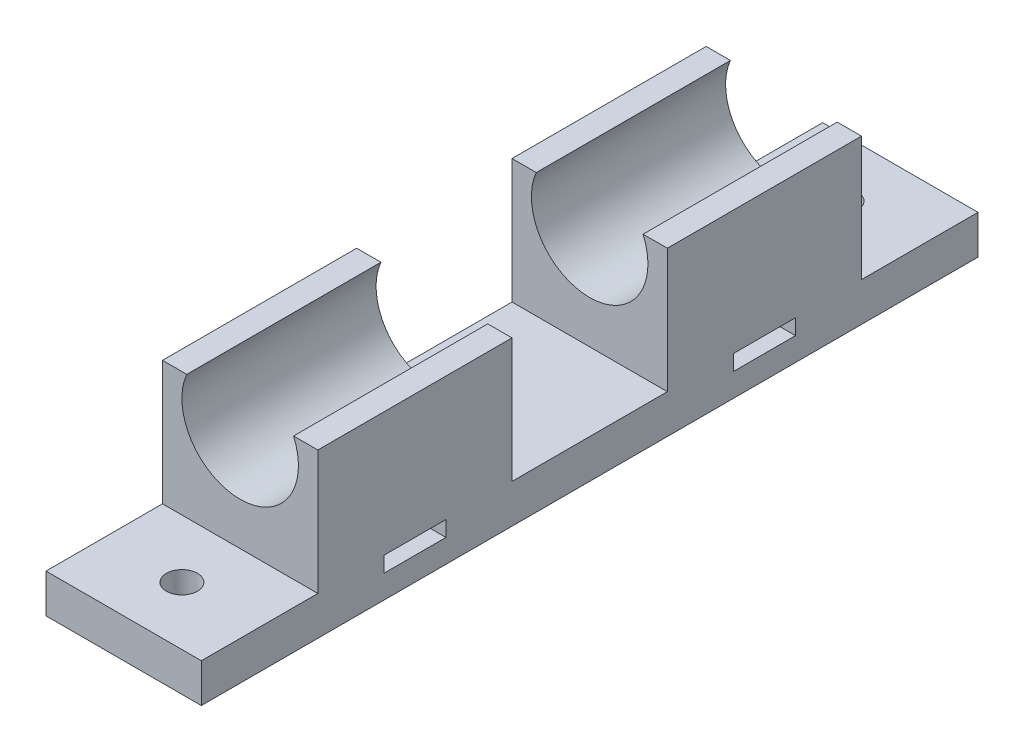
ISO-10303-21;
HEADER;
FILE_DESCRIPTION(('STEP AP214'),'2;1');
FILE_NAME('part.step','',(''),(''),'','','');
FILE_SCHEMA(('AUTOMOTIVE_DESIGN { 1 0 10303 214 1 1 1 1 }'));
ENDSEC;
DATA;
#1=APPLICATION_CONTEXT('core data for automotive mechanical design processes');
#2=APPLICATION_PROTOCOL_DEFINITION('international standard','automotive_design',2000,#1);
#3=PRODUCT_CONTEXT('',#1,'mechanical');
#4=PRODUCT('Part','Part','',(#3));
#5=PRODUCT_RELATED_PRODUCT_CATEGORY('part','',(#4));
#6=PRODUCT_DEFINITION_FORMATION('','',#4);
#7=PRODUCT_DEFINITION_CONTEXT('part definition',#1,'design');
#8=PRODUCT_DEFINITION('design','',#6,#7);
#9=PRODUCT_DEFINITION_SHAPE('','',#8);
#10=(LENGTH_UNIT() NAMED_UNIT(*) SI_UNIT(.MILLI.,.METRE.));
#11=(NAMED_UNIT(*) PLANE_ANGLE_UNIT() SI_UNIT($,.RADIAN.));
#12=(NAMED_UNIT(*) SI_UNIT($,.STERADIAN.) SOLID_ANGLE_UNIT());
#13=UNCERTAINTY_MEASURE_WITH_UNIT(LENGTH_MEASURE(1.E-05),#10,'distance_accuracy_value','');
#14=(GEOMETRIC_REPRESENTATION_CONTEXT(3) GLOBAL_UNCERTAINTY_ASSIGNED_CONTEXT((#13)) GLOBAL_UNIT_ASSIGNED_CONTEXT((#10,
#11,#12)) REPRESENTATION_CONTEXT('',''));
#15=CARTESIAN_POINT('',(0.,0.,0.));
#16=DIRECTION('',(0.,0.,1.));
#17=DIRECTION('',(1.,0.,0.));
#18=AXIS2_PLACEMENT_3D('',#15,#16,#17);
#19=CARTESIAN_POINT('',(10.,21.,35.));
#20=DIRECTION('',(0.,0.,-1.));
#21=DIRECTION('',(-1.,0.,0.));
#22=AXIS2_PLACEMENT_3D('',#19,#20,#21);
#23=PLANE('',#22);
#24=DIRECTION('',(-1.,0.,0.));
#25=VECTOR('',#24,1.);
#26=CARTESIAN_POINT('',(-10.,5.,35.));
#27=LINE('',#26,#25);
#28=CARTESIAN_POINT('',(10.,5.,35.));
#29=VERTEX_POINT('',#28);
#30=CARTESIAN_POINT('',(-10.,5.,35.));
#31=VERTEX_POINT('',#30);
#32=EDGE_CURVE('E47',#29,#31,#27,.T.);
#33=ORIENTED_EDGE('',*,*,#32,.F.);
#34=DIRECTION('',(0.,-1.,0.));
#35=VECTOR('',#34,1.);
#36=CARTESIAN_POINT('',(10.,21.,35.));
#37=LINE('',#36,#35);
#38=CARTESIAN_POINT('',(10.,21.,35.));
#39=VERTEX_POINT('',#38);
#40=EDGE_CURVE('E332',#39,#29,#37,.T.);
#41=ORIENTED_EDGE('',*,*,#40,.F.);
#42=DIRECTION('',(-1.,0.,0.));
#43=VECTOR('',#42,1.);
#44=CARTESIAN_POINT('',(10.,21.,35.));
#45=LINE('',#44,#43);
#46=CARTESIAN_POINT('',(6.87386354243376,21.,35.));
#47=VERTEX_POINT('',#46);
#48=EDGE_CURVE('E363',#39,#47,#45,.T.);
#49=ORIENTED_EDGE('',*,*,#48,.T.);
#50=CARTESIAN_POINT('',(0.,18.,35.));
#51=DIRECTION('',(0.,0.,1.));
#52=DIRECTION('',(1.,0.,0.));
#53=AXIS2_PLACEMENT_3D('',#50,#51,#52);
#54=CIRCLE('',#53,7.5);
#55=CARTESIAN_POINT('',(-6.87386354243376,21.,35.));
#56=VERTEX_POINT('',#55);
#57=EDGE_CURVE('E256',#56,#47,#54,.T.);
#58=ORIENTED_EDGE('',*,*,#57,.F.);
#59=CARTESIAN_POINT('',(-10.,21.,35.));
#60=VERTEX_POINT('',#59);
#61=EDGE_CURVE('E196',#56,#60,#45,.T.);
#62=ORIENTED_EDGE('',*,*,#61,.T.);
#63=DIRECTION('',(0.,-1.,0.));
#64=VECTOR('',#63,1.);
#65=CARTESIAN_POINT('',(-10.,21.,35.));
#66=LINE('',#65,#64);
#67=EDGE_CURVE('E192',#60,#31,#66,.T.);
#68=ORIENTED_EDGE('',*,*,#67,.T.);
#69=EDGE_LOOP('',(#33,#41,#49,#58,#62,#68));
#70=FACE_BOUND('',#69,.T.);
#71=ADVANCED_FACE('F33',(#70),#23,.F.);
#72=CARTESIAN_POINT('',(10.,21.,-35.));
#73=DIRECTION('',(0.,0.,1.));
#74=DIRECTION('',(1.,0.,0.));
#75=AXIS2_PLACEMENT_3D('',#72,#73,#74);
#76=PLANE('',#75);
#77=DIRECTION('',(1.,0.,0.));
#78=VECTOR('',#77,1.);
#79=CARTESIAN_POINT('',(-10.,5.,-35.));
#80=LINE('',#79,#78);
#81=CARTESIAN_POINT('',(-10.,5.,-35.));
#82=VERTEX_POINT('',#81);
#83=CARTESIAN_POINT('',(10.,5.,-35.));
#84=VERTEX_POINT('',#83);
#85=EDGE_CURVE('E55',#82,#84,#80,.T.);
#86=ORIENTED_EDGE('',*,*,#85,.F.);
#87=DIRECTION('',(0.,1.,0.));
#88=VECTOR('',#87,1.);
#89=CARTESIAN_POINT('',(-10.,21.,-35.));
#90=LINE('',#89,#88);
#91=CARTESIAN_POINT('',(-10.,21.,-35.));
#92=VERTEX_POINT('',#91);
#93=EDGE_CURVE('E350',#82,#92,#90,.T.);
#94=ORIENTED_EDGE('',*,*,#93,.T.);
#95=DIRECTION('',(-1.,0.,0.));
#96=VECTOR('',#95,1.);
#97=CARTESIAN_POINT('',(10.,21.,-35.));
#98=LINE('',#97,#96);
#99=CARTESIAN_POINT('',(-6.87386354243376,21.,-35.));
#100=VERTEX_POINT('',#99);
#101=EDGE_CURVE('E380',#100,#92,#98,.T.);
#102=ORIENTED_EDGE('',*,*,#101,.F.);
#103=CARTESIAN_POINT('',(0.,18.,-35.));
#104=DIRECTION('',(0.,0.,1.));
#105=DIRECTION('',(1.,0.,0.));
#106=AXIS2_PLACEMENT_3D('',#103,#104,#105);
#107=CIRCLE('',#106,7.5);
#108=CARTESIAN_POINT('',(6.87386354243376,21.,-35.));
#109=VERTEX_POINT('',#108);
#110=EDGE_CURVE('E257',#109,#100,#107,.F.);
#111=ORIENTED_EDGE('',*,*,#110,.F.);
#112=CARTESIAN_POINT('',(10.,21.,-35.));
#113=VERTEX_POINT('',#112);
#114=EDGE_CURVE('E381',#113,#109,#98,.T.);
#115=ORIENTED_EDGE('',*,*,#114,.F.);
#116=DIRECTION('',(0.,1.,0.));
#117=VECTOR('',#116,1.);
#118=CARTESIAN_POINT('',(10.,21.,-35.));
#119=LINE('',#118,#117);
#120=EDGE_CURVE('E337',#84,#113,#119,.T.);
#121=ORIENTED_EDGE('',*,*,#120,.F.);
#122=EDGE_LOOP('',(#86,#94,#102,#111,#115,#121));
#123=FACE_BOUND('',#122,.T.);
#124=ADVANCED_FACE('F450',(#123),#76,.F.);
#125=CARTESIAN_POINT('',(10.,21.,-9.99999999999999));
#126=DIRECTION('',(0.,-1.,0.));
#127=DIRECTION('',(0.,0.,-1.));
#128=AXIS2_PLACEMENT_3D('',#125,#126,#127);
#129=PLANE('',#128);
#130=ORIENTED_EDGE('',*,*,#114,.T.);
#131=DIRECTION('',(0.,0.,1.));
#132=VECTOR('',#131,1.);
#133=CARTESIAN_POINT('',(6.87386354243376,21.,-53.3098334236005));
#134=LINE('',#133,#132);
#135=CARTESIAN_POINT('',(6.87386354243376,21.,-9.99999999999999));
#136=VERTEX_POINT('',#135);
#137=EDGE_CURVE('E262',#109,#136,#134,.T.);
#138=ORIENTED_EDGE('',*,*,#137,.T.);
#139=DIRECTION('',(-1.,0.,0.));
#140=VECTOR('',#139,1.);
#141=CARTESIAN_POINT('',(10.,21.,-9.99999999999999));
#142=LINE('',#141,#140);
#143=CARTESIAN_POINT('',(10.,21.,-9.99999999999999));
#144=VERTEX_POINT('',#143);
#145=EDGE_CURVE('E377',#144,#136,#142,.T.);
#146=ORIENTED_EDGE('',*,*,#145,.F.);
#147=DIRECTION('',(0.,0.,1.));
#148=VECTOR('',#147,1.);
#149=CARTESIAN_POINT('',(10.,21.,-9.99999999999999));
#150=LINE('',#149,#148);
#151=EDGE_CURVE('E339',#113,#144,#150,.T.);
#152=ORIENTED_EDGE('',*,*,#151,.F.);
#153=EDGE_LOOP('',(#130,#138,#146,#152));
#154=FACE_BOUND('',#153,.T.);
#155=ADVANCED_FACE('F454',(#154),#129,.F.);
#156=CARTESIAN_POINT('',(10.,21.,35.));
#157=DIRECTION('',(0.,-1.,0.));
#158=DIRECTION('',(0.,0.,-1.));
#159=AXIS2_PLACEMENT_3D('',#156,#157,#158);
#160=PLANE('',#159);
#161=DIRECTION('',(-1.,0.,0.));
#162=VECTOR('',#161,1.);
#163=CARTESIAN_POINT('',(10.,21.,9.99999999999999));
#164=LINE('',#163,#162);
#165=CARTESIAN_POINT('',(10.,21.,9.99999999999999));
#166=VERTEX_POINT('',#165);
#167=CARTESIAN_POINT('',(6.87386354243376,21.,9.99999999999999));
#168=VERTEX_POINT('',#167);
#169=EDGE_CURVE('E367',#166,#168,#164,.T.);
#170=ORIENTED_EDGE('',*,*,#169,.T.);
#171=DIRECTION('',(0.,0.,1.));
#172=VECTOR('',#171,1.);
#173=CARTESIAN_POINT('',(6.87386354243376,21.,-53.3098334236005));
#174=LINE('',#173,#172);
#175=EDGE_CURVE('E11',#168,#47,#174,.T.);
#176=ORIENTED_EDGE('',*,*,#175,.T.);
#177=ORIENTED_EDGE('',*,*,#48,.F.);
#178=DIRECTION('',(0.,0.,1.));
#179=VECTOR('',#178,1.);
#180=CARTESIAN_POINT('',(10.,21.,35.));
#181=LINE('',#180,#179);
#182=EDGE_CURVE('E347',#166,#39,#181,.T.);
#183=ORIENTED_EDGE('',*,*,#182,.F.);
#184=EDGE_LOOP('',(#170,#176,#177,#183));
#185=FACE_BOUND('',#184,.T.);
#186=ADVANCED_FACE('F434',(#185),#160,.F.);
#187=CARTESIAN_POINT('',(10.,0.,0.));
#188=DIRECTION('',(1.,0.,0.));
#189=DIRECTION('',(0.,0.,-1.));
#190=AXIS2_PLACEMENT_3D('',#187,#188,#189);
#191=PLANE('',#190);
#192=ORIENTED_EDGE('',*,*,#40,.T.);
#193=DIRECTION('',(0.,0.,-1.));
#194=VECTOR('',#193,1.);
#195=CARTESIAN_POINT('',(10.,5.,35.));
#196=LINE('',#195,#194);
#197=CARTESIAN_POINT('',(10.,4.99999999999999,50.));
#198=VERTEX_POINT('',#197);
#199=EDGE_CURVE('E217',#198,#29,#196,.T.);
#200=ORIENTED_EDGE('',*,*,#199,.F.);
#201=DIRECTION('',(0.,1.,0.));
#202=VECTOR('',#201,1.);
#203=CARTESIAN_POINT('',(10.,-25.,50.));
#204=LINE('',#203,#202);
#205=CARTESIAN_POINT('',(10.,0.,50.));
#206=VERTEX_POINT('',#205);
#207=EDGE_CURVE('E226',#206,#198,#204,.T.);
#208=ORIENTED_EDGE('',*,*,#207,.F.);
#209=DIRECTION('',(0.,0.,-1.));
#210=VECTOR('',#209,1.);
#211=CARTESIAN_POINT('',(10.,0.,35.));
#212=LINE('',#211,#210);
#213=CARTESIAN_POINT('',(10.,0.,-50.));
#214=VERTEX_POINT('',#213);
#215=EDGE_CURVE('E334',#206,#214,#212,.T.);
#216=ORIENTED_EDGE('',*,*,#215,.T.);
#217=DIRECTION('',(0.,1.,0.));
#218=VECTOR('',#217,1.);
#219=CARTESIAN_POINT('',(10.,-25.,-50.));
#220=LINE('',#219,#218);
#221=CARTESIAN_POINT('',(10.,5.00000000000001,-50.));
#222=VERTEX_POINT('',#221);
#223=EDGE_CURVE('E251',#214,#222,#220,.T.);
#224=ORIENTED_EDGE('',*,*,#223,.T.);
#225=DIRECTION('',(0.,0.,-1.));
#226=VECTOR('',#225,1.);
#227=CARTESIAN_POINT('',(10.,5.,-35.));
#228=LINE('',#227,#226);
#229=EDGE_CURVE('E245',#84,#222,#228,.T.);
#230=ORIENTED_EDGE('',*,*,#229,.F.);
#231=ORIENTED_EDGE('',*,*,#120,.T.);
#232=ORIENTED_EDGE('',*,*,#151,.T.);
#233=DIRECTION('',(0.,-1.,0.));
#234=VECTOR('',#233,1.);
#235=CARTESIAN_POINT('',(10.,21.,-9.99999999999999));
#236=LINE('',#235,#234);
#237=CARTESIAN_POINT('',(10.,5.,-10.));
#238=VERTEX_POINT('',#237);
#239=EDGE_CURVE('E341',#144,#238,#236,.T.);
#240=ORIENTED_EDGE('',*,*,#239,.T.);
#241=DIRECTION('',(0.,0.,1.));
#242=VECTOR('',#241,1.);
#243=CARTESIAN_POINT('',(10.,5.,10.));
#244=LINE('',#243,#242);
#245=CARTESIAN_POINT('',(10.,5.,10.));
#246=VERTEX_POINT('',#245);
#247=EDGE_CURVE('E343',#238,#246,#244,.T.);
#248=ORIENTED_EDGE('',*,*,#247,.T.);
#249=DIRECTION('',(0.,1.,0.));
#250=VECTOR('',#249,1.);
#251=CARTESIAN_POINT('',(10.,21.,9.99999999999999));
#252=LINE('',#251,#250);
#253=EDGE_CURVE('E345',#246,#166,#252,.T.);
#254=ORIENTED_EDGE('',*,*,#253,.T.);
#255=ORIENTED_EDGE('',*,*,#182,.T.);
#256=EDGE_LOOP('',(#192,#200,#208,#216,#224,#230,#231,#232,#240,#248,#254,#255));
#257=FACE_BOUND('',#256,.T.);
#258=DIRECTION('',(0.,0.,-1.));
#259=VECTOR('',#258,1.);
#260=CARTESIAN_POINT('',(10.,3.,-18.5));
#261=LINE('',#260,#259);
#262=CARTESIAN_POINT('',(10.,3.,-18.5));
#263=VERTEX_POINT('',#262);
#264=CARTESIAN_POINT('',(10.,3.00000000000001,-26.5));
#265=VERTEX_POINT('',#264);
#266=EDGE_CURVE('E305',#263,#265,#261,.T.);
#267=ORIENTED_EDGE('',*,*,#266,.F.);
#268=DIRECTION('',(0.,-1.,0.));
#269=VECTOR('',#268,1.);
#270=CARTESIAN_POINT('',(10.,5.00000000000001,-18.5));
#271=LINE('',#270,#269);
#272=CARTESIAN_POINT('',(10.,5.00000000000001,-18.5));
#273=VERTEX_POINT('',#272);
#274=EDGE_CURVE('E303',#273,#263,#271,.T.);
#275=ORIENTED_EDGE('',*,*,#274,.F.);
#276=DIRECTION('',(0.,0.,1.));
#277=VECTOR('',#276,1.);
#278=CARTESIAN_POINT('',(10.,5.00000000000001,-18.5));
#279=LINE('',#278,#277);
#280=CARTESIAN_POINT('',(10.,5.00000000000001,-26.5));
#281=VERTEX_POINT('',#280);
#282=EDGE_CURVE('E311',#281,#273,#279,.T.);
#283=ORIENTED_EDGE('',*,*,#282,.F.);
#284=DIRECTION('',(0.,1.,0.));
#285=VECTOR('',#284,1.);
#286=CARTESIAN_POINT('',(10.,5.00000000000001,-26.5));
#287=LINE('',#286,#285);
#288=EDGE_CURVE('E308',#265,#281,#287,.T.);
#289=ORIENTED_EDGE('',*,*,#288,.F.);
#290=EDGE_LOOP('',(#267,#275,#283,#289));
#291=FACE_BOUND('',#290,.T.);
#292=DIRECTION('',(0.,0.,-1.));
#293=VECTOR('',#292,1.);
#294=CARTESIAN_POINT('',(10.,3.,18.5));
#295=LINE('',#294,#293);
#296=CARTESIAN_POINT('',(10.,3.,26.5));
#297=VERTEX_POINT('',#296);
#298=CARTESIAN_POINT('',(10.,3.,18.5));
#299=VERTEX_POINT('',#298);
#300=EDGE_CURVE('E274',#297,#299,#295,.T.);
#301=ORIENTED_EDGE('',*,*,#300,.F.);
#302=DIRECTION('',(0.,-1.,0.));
#303=VECTOR('',#302,1.);
#304=CARTESIAN_POINT('',(10.,5.,26.5));
#305=LINE('',#304,#303);
#306=CARTESIAN_POINT('',(10.,5.,26.5));
#307=VERTEX_POINT('',#306);
#308=EDGE_CURVE('E272',#307,#297,#305,.T.);
#309=ORIENTED_EDGE('',*,*,#308,.F.);
#310=DIRECTION('',(0.,0.,1.));
#311=VECTOR('',#310,1.);
#312=CARTESIAN_POINT('',(10.,5.,18.5));
#313=LINE('',#312,#311);
#314=CARTESIAN_POINT('',(10.,5.,18.5));
#315=VERTEX_POINT('',#314);
#316=EDGE_CURVE('E280',#315,#307,#313,.T.);
#317=ORIENTED_EDGE('',*,*,#316,.F.);
#318=DIRECTION('',(0.,1.,0.));
#319=VECTOR('',#318,1.);
#320=CARTESIAN_POINT('',(10.,5.,18.5));
#321=LINE('',#320,#319);
#322=EDGE_CURVE('E277',#299,#315,#321,.T.);
#323=ORIENTED_EDGE('',*,*,#322,.F.);
#324=EDGE_LOOP('',(#301,#309,#317,#323));
#325=FACE_BOUND('',#324,.T.);
#326=ADVANCED_FACE('F429',(#257,#291,#325),#191,.T.);
#327=CARTESIAN_POINT('',(-10.,0.,0.));
#328=DIRECTION('',(1.,0.,0.));
#329=DIRECTION('',(0.,0.,-1.));
#330=AXIS2_PLACEMENT_3D('',#327,#328,#329);
#331=PLANE('',#330);
#332=DIRECTION('',(0.,-1.,0.));
#333=VECTOR('',#332,1.);
#334=CARTESIAN_POINT('',(-10.,5.00000000000001,-18.5));
#335=LINE('',#334,#333);
#336=CARTESIAN_POINT('',(-10.,5.00000000000001,-18.5));
#337=VERTEX_POINT('',#336);
#338=CARTESIAN_POINT('',(-10.,3.,-18.5));
#339=VERTEX_POINT('',#338);
#340=EDGE_CURVE('E302',#337,#339,#335,.T.);
#341=ORIENTED_EDGE('',*,*,#340,.T.);
#342=DIRECTION('',(0.,0.,-1.));
#343=VECTOR('',#342,1.);
#344=CARTESIAN_POINT('',(-10.,3.,-18.5));
#345=LINE('',#344,#343);
#346=CARTESIAN_POINT('',(-10.,3.00000000000001,-26.5));
#347=VERTEX_POINT('',#346);
#348=EDGE_CURVE('E316',#339,#347,#345,.T.);
#349=ORIENTED_EDGE('',*,*,#348,.T.);
#350=DIRECTION('',(0.,1.,0.));
#351=VECTOR('',#350,1.);
#352=CARTESIAN_POINT('',(-10.,5.00000000000001,-26.5));
#353=LINE('',#352,#351);
#354=CARTESIAN_POINT('',(-10.,5.00000000000001,-26.5));
#355=VERTEX_POINT('',#354);
#356=EDGE_CURVE('E319',#347,#355,#353,.T.);
#357=ORIENTED_EDGE('',*,*,#356,.T.);
#358=DIRECTION('',(0.,0.,1.));
#359=VECTOR('',#358,1.);
#360=CARTESIAN_POINT('',(-10.,5.00000000000001,-18.5));
#361=LINE('',#360,#359);
#362=EDGE_CURVE('E306',#355,#337,#361,.T.);
#363=ORIENTED_EDGE('',*,*,#362,.T.);
#364=EDGE_LOOP('',(#341,#349,#357,#363));
#365=FACE_BOUND('',#364,.T.);
#366=ORIENTED_EDGE('',*,*,#67,.F.);
#367=DIRECTION('',(0.,0.,1.));
#368=VECTOR('',#367,1.);
#369=CARTESIAN_POINT('',(-10.,21.,35.));
#370=LINE('',#369,#368);
#371=CARTESIAN_POINT('',(-10.,21.,9.99999999999999));
#372=VERTEX_POINT('',#371);
#373=EDGE_CURVE('E335',#372,#60,#370,.T.);
#374=ORIENTED_EDGE('',*,*,#373,.F.);
#375=DIRECTION('',(0.,1.,0.));
#376=VECTOR('',#375,1.);
#377=CARTESIAN_POINT('',(-10.,21.,9.99999999999999));
#378=LINE('',#377,#376);
#379=CARTESIAN_POINT('',(-10.,5.,10.));
#380=VERTEX_POINT('',#379);
#381=EDGE_CURVE('E359',#380,#372,#378,.T.);
#382=ORIENTED_EDGE('',*,*,#381,.F.);
#383=DIRECTION('',(0.,0.,1.));
#384=VECTOR('',#383,1.);
#385=CARTESIAN_POINT('',(-10.,5.,10.));
#386=LINE('',#385,#384);
#387=CARTESIAN_POINT('',(-10.,5.,-10.));
#388=VERTEX_POINT('',#387);
#389=EDGE_CURVE('E357',#388,#380,#386,.T.);
#390=ORIENTED_EDGE('',*,*,#389,.F.);
#391=DIRECTION('',(0.,-1.,0.));
#392=VECTOR('',#391,1.);
#393=CARTESIAN_POINT('',(-10.,21.,-9.99999999999999));
#394=LINE('',#393,#392);
#395=CARTESIAN_POINT('',(-10.,21.,-9.99999999999999));
#396=VERTEX_POINT('',#395);
#397=EDGE_CURVE('E355',#396,#388,#394,.T.);
#398=ORIENTED_EDGE('',*,*,#397,.F.);
#399=DIRECTION('',(0.,0.,1.));
#400=VECTOR('',#399,1.);
#401=CARTESIAN_POINT('',(-10.,21.,-9.99999999999999));
#402=LINE('',#401,#400);
#403=EDGE_CURVE('E352',#92,#396,#402,.T.);
#404=ORIENTED_EDGE('',*,*,#403,.F.);
#405=ORIENTED_EDGE('',*,*,#93,.F.);
#406=DIRECTION('',(0.,0.,1.));
#407=VECTOR('',#406,1.);
#408=CARTESIAN_POINT('',(-10.,5.,-35.));
#409=LINE('',#408,#407);
#410=CARTESIAN_POINT('',(-10.,5.00000000000001,-50.));
#411=VERTEX_POINT('',#410);
#412=EDGE_CURVE('E241',#411,#82,#409,.T.);
#413=ORIENTED_EDGE('',*,*,#412,.F.);
#414=DIRECTION('',(0.,1.,0.));
#415=VECTOR('',#414,1.);
#416=CARTESIAN_POINT('',(-10.,-25.,-50.));
#417=LINE('',#416,#415);
#418=CARTESIAN_POINT('',(-10.,0.,-50.));
#419=VERTEX_POINT('',#418);
#420=EDGE_CURVE('E238',#419,#411,#417,.T.);
#421=ORIENTED_EDGE('',*,*,#420,.F.);
#422=DIRECTION('',(0.,0.,-1.));
#423=VECTOR('',#422,1.);
#424=CARTESIAN_POINT('',(-10.,0.,35.));
#425=LINE('',#424,#423);
#426=CARTESIAN_POINT('',(-10.,0.,50.));
#427=VERTEX_POINT('',#426);
#428=EDGE_CURVE('E200',#427,#419,#425,.T.);
#429=ORIENTED_EDGE('',*,*,#428,.F.);
#430=DIRECTION('',(0.,1.,0.));
#431=VECTOR('',#430,1.);
#432=CARTESIAN_POINT('',(-10.,-25.,50.));
#433=LINE('',#432,#431);
#434=CARTESIAN_POINT('',(-10.,4.99999999999999,50.));
#435=VERTEX_POINT('',#434);
#436=EDGE_CURVE('E208',#427,#435,#433,.T.);
#437=ORIENTED_EDGE('',*,*,#436,.T.);
#438=DIRECTION('',(0.,0.,1.));
#439=VECTOR('',#438,1.);
#440=CARTESIAN_POINT('',(-10.,5.,35.));
#441=LINE('',#440,#439);
#442=EDGE_CURVE('E204',#31,#435,#441,.T.);
#443=ORIENTED_EDGE('',*,*,#442,.F.);
#444=EDGE_LOOP('',(#366,#374,#382,#390,#398,#404,#405,#413,#421,#429,#437,#443));
#445=FACE_BOUND('',#444,.T.);
#446=DIRECTION('',(0.,-1.,0.));
#447=VECTOR('',#446,1.);
#448=CARTESIAN_POINT('',(-10.,5.,26.5));
#449=LINE('',#448,#447);
#450=CARTESIAN_POINT('',(-10.,5.,26.5));
#451=VERTEX_POINT('',#450);
#452=CARTESIAN_POINT('',(-10.,3.,26.5));
#453=VERTEX_POINT('',#452);
#454=EDGE_CURVE('E271',#451,#453,#449,.T.);
#455=ORIENTED_EDGE('',*,*,#454,.T.);
#456=DIRECTION('',(0.,0.,-1.));
#457=VECTOR('',#456,1.);
#458=CARTESIAN_POINT('',(-10.,3.,18.5));
#459=LINE('',#458,#457);
#460=CARTESIAN_POINT('',(-10.,3.,18.5));
#461=VERTEX_POINT('',#460);
#462=EDGE_CURVE('E285',#453,#461,#459,.T.);
#463=ORIENTED_EDGE('',*,*,#462,.T.);
#464=DIRECTION('',(0.,1.,0.));
#465=VECTOR('',#464,1.);
#466=CARTESIAN_POINT('',(-10.,5.,18.5));
#467=LINE('',#466,#465);
#468=CARTESIAN_POINT('',(-10.,5.,18.5));
#469=VERTEX_POINT('',#468);
#470=EDGE_CURVE('E288',#461,#469,#467,.T.);
#471=ORIENTED_EDGE('',*,*,#470,.T.);
#472=DIRECTION('',(0.,0.,1.));
#473=VECTOR('',#472,1.);
#474=CARTESIAN_POINT('',(-10.,5.,18.5));
#475=LINE('',#474,#473);
#476=EDGE_CURVE('E275',#469,#451,#475,.T.);
#477=ORIENTED_EDGE('',*,*,#476,.T.);
#478=EDGE_LOOP('',(#455,#463,#471,#477));
#479=FACE_BOUND('',#478,.T.);
#480=ADVANCED_FACE('F205',(#365,#445,#479),#331,.F.);
#481=CARTESIAN_POINT('',(10.,0.,35.));
#482=DIRECTION('',(0.,1.,0.));
#483=DIRECTION('',(0.,0.,1.));
#484=AXIS2_PLACEMENT_3D('',#481,#482,#483);
#485=PLANE('',#484);
#486=ORIENTED_EDGE('',*,*,#428,.T.);
#487=DIRECTION('',(1.,0.,0.));
#488=VECTOR('',#487,1.);
#489=CARTESIAN_POINT('',(-10.,0.,-50.));
#490=LINE('',#489,#488);
#491=EDGE_CURVE('E234',#419,#214,#490,.T.);
#492=ORIENTED_EDGE('',*,*,#491,.T.);
#493=ORIENTED_EDGE('',*,*,#215,.F.);
#494=DIRECTION('',(-1.,0.,0.));
#495=VECTOR('',#494,1.);
#496=CARTESIAN_POINT('',(-10.,0.,50.));
#497=LINE('',#496,#495);
#498=EDGE_CURVE('E228',#206,#427,#497,.T.);
#499=ORIENTED_EDGE('',*,*,#498,.T.);
#500=EDGE_LOOP('',(#486,#492,#493,#499));
#501=FACE_BOUND('',#500,.T.);
#502=CARTESIAN_POINT('',(0.,0.,-42.5));
#503=DIRECTION('',(0.,1.,0.));
#504=DIRECTION('',(0.,0.,1.));
#505=AXIS2_PLACEMENT_3D('',#502,#503,#504);
#506=CIRCLE('',#505,2.);
#507=CARTESIAN_POINT('',(0.,0.,-40.5));
#508=VERTEX_POINT('',#507);
#509=EDGE_CURVE('E237',#508,#508,#506,.F.);
#510=ORIENTED_EDGE('',*,*,#509,.F.);
#511=EDGE_LOOP('',(#510));
#512=FACE_BOUND('',#511,.T.);
#513=CARTESIAN_POINT('',(0.,0.,42.5));
#514=DIRECTION('',(0.,1.,0.));
#515=DIRECTION('',(0.,0.,1.));
#516=AXIS2_PLACEMENT_3D('',#513,#514,#515);
#517=CIRCLE('',#516,2.);
#518=CARTESIAN_POINT('',(0.,0.,44.5));
#519=VERTEX_POINT('',#518);
#520=EDGE_CURVE('E230',#519,#519,#517,.F.);
#521=ORIENTED_EDGE('',*,*,#520,.F.);
#522=EDGE_LOOP('',(#521));
#523=FACE_BOUND('',#522,.T.);
#524=ADVANCED_FACE('F423',(#501,#512,#523),#485,.F.);
#525=CARTESIAN_POINT('',(-6.87386354243376,21.,-9.99999999999999));
#526=VERTEX_POINT('',#525);
#527=EDGE_CURVE('E376',#526,#396,#142,.T.);
#528=ORIENTED_EDGE('',*,*,#527,.F.);
#529=DIRECTION('',(0.,0.,1.));
#530=VECTOR('',#529,1.);
#531=CARTESIAN_POINT('',(-6.87386354243376,21.,-53.3098334236005));
#532=LINE('',#531,#530);
#533=EDGE_CURVE('E260',#100,#526,#532,.T.);
#534=ORIENTED_EDGE('',*,*,#533,.F.);
#535=ORIENTED_EDGE('',*,*,#101,.T.);
#536=ORIENTED_EDGE('',*,*,#403,.T.);
#537=EDGE_LOOP('',(#528,#534,#535,#536));
#538=FACE_BOUND('',#537,.T.);
#539=ADVANCED_FACE('F408',(#538),#129,.F.);
#540=CARTESIAN_POINT('',(10.,21.,-9.99999999999999));
#541=DIRECTION('',(0.,0.,-1.));
#542=DIRECTION('',(0.,1.,0.));
#543=AXIS2_PLACEMENT_3D('',#540,#541,#542);
#544=PLANE('',#543);
#545=ORIENTED_EDGE('',*,*,#145,.T.);
#546=CARTESIAN_POINT('',(0.,18.,-9.99999999999999));
#547=DIRECTION('',(0.,0.,-1.));
#548=DIRECTION('',(0.,1.,0.));
#549=AXIS2_PLACEMENT_3D('',#546,#547,#548);
#550=CIRCLE('',#549,7.5);
#551=EDGE_CURVE('E268',#136,#526,#550,.T.);
#552=ORIENTED_EDGE('',*,*,#551,.T.);
#553=ORIENTED_EDGE('',*,*,#527,.T.);
#554=ORIENTED_EDGE('',*,*,#397,.T.);
#555=DIRECTION('',(-1.,0.,0.));
#556=VECTOR('',#555,1.);
#557=CARTESIAN_POINT('',(10.,5.,-10.));
#558=LINE('',#557,#556);
#559=EDGE_CURVE('E373',#238,#388,#558,.T.);
#560=ORIENTED_EDGE('',*,*,#559,.F.);
#561=ORIENTED_EDGE('',*,*,#239,.F.);
#562=EDGE_LOOP('',(#545,#552,#553,#554,#560,#561));
#563=FACE_BOUND('',#562,.T.);
#564=ADVANCED_FACE('F403',(#563),#544,.F.);
#565=CARTESIAN_POINT('',(10.,5.,10.));
#566=DIRECTION('',(0.,-1.,0.));
#567=DIRECTION('',(0.,0.,-1.));
#568=AXIS2_PLACEMENT_3D('',#565,#566,#567);
#569=PLANE('',#568);
#570=ORIENTED_EDGE('',*,*,#389,.T.);
#571=DIRECTION('',(-1.,0.,0.));
#572=VECTOR('',#571,1.);
#573=CARTESIAN_POINT('',(10.,5.,10.));
#574=LINE('',#573,#572);
#575=EDGE_CURVE('E370',#246,#380,#574,.T.);
#576=ORIENTED_EDGE('',*,*,#575,.F.);
#577=ORIENTED_EDGE('',*,*,#247,.F.);
#578=ORIENTED_EDGE('',*,*,#559,.T.);
#579=EDGE_LOOP('',(#570,#576,#577,#578));
#580=FACE_BOUND('',#579,.T.);
#581=ADVANCED_FACE('F398',(#580),#569,.F.);
#582=CARTESIAN_POINT('',(10.,21.,9.99999999999999));
#583=DIRECTION('',(0.,0.,1.));
#584=DIRECTION('',(0.,-1.,0.));
#585=AXIS2_PLACEMENT_3D('',#582,#583,#584);
#586=PLANE('',#585);
#587=CARTESIAN_POINT('',(-6.87386354243376,21.,9.99999999999999));
#588=VERTEX_POINT('',#587);
#589=EDGE_CURVE('E366',#588,#372,#164,.T.);
#590=ORIENTED_EDGE('',*,*,#589,.F.);
#591=CARTESIAN_POINT('',(0.,18.,9.99999999999999));
#592=DIRECTION('',(0.,0.,1.));
#593=DIRECTION('',(0.,-1.,0.));
#594=AXIS2_PLACEMENT_3D('',#591,#592,#593);
#595=CIRCLE('',#594,7.5);
#596=EDGE_CURVE('E259',#588,#168,#595,.T.);
#597=ORIENTED_EDGE('',*,*,#596,.T.);
#598=ORIENTED_EDGE('',*,*,#169,.F.);
#599=ORIENTED_EDGE('',*,*,#253,.F.);
#600=ORIENTED_EDGE('',*,*,#575,.T.);
#601=ORIENTED_EDGE('',*,*,#381,.T.);
#602=EDGE_LOOP('',(#590,#597,#598,#599,#600,#601));
#603=FACE_BOUND('',#602,.T.);
#604=ADVANCED_FACE('F389',(#603),#586,.F.);
#605=ORIENTED_EDGE('',*,*,#61,.F.);
#606=DIRECTION('',(0.,0.,1.));
#607=VECTOR('',#606,1.);
#608=CARTESIAN_POINT('',(-6.87386354243376,21.,-53.3098334236005));
#609=LINE('',#608,#607);
#610=EDGE_CURVE('E40',#56,#588,#609,.F.);
#611=ORIENTED_EDGE('',*,*,#610,.T.);
#612=ORIENTED_EDGE('',*,*,#589,.T.);
#613=ORIENTED_EDGE('',*,*,#373,.T.);
#614=EDGE_LOOP('',(#605,#611,#612,#613));
#615=FACE_BOUND('',#614,.T.);
#616=ADVANCED_FACE('F386',(#615),#160,.F.);
#617=CARTESIAN_POINT('',(10.,5.00000000000001,-18.5));
#618=DIRECTION('',(0.,0.,-1.));
#619=DIRECTION('',(-1.,0.,0.));
#620=AXIS2_PLACEMENT_3D('',#617,#618,#619);
#621=PLANE('',#620);
#622=ORIENTED_EDGE('',*,*,#340,.F.);
#623=DIRECTION('',(-1.,0.,0.));
#624=VECTOR('',#623,1.);
#625=CARTESIAN_POINT('',(10.,5.00000000000001,-18.5));
#626=LINE('',#625,#624);
#627=EDGE_CURVE('E313',#273,#337,#626,.T.);
#628=ORIENTED_EDGE('',*,*,#627,.F.);
#629=ORIENTED_EDGE('',*,*,#274,.T.);
#630=DIRECTION('',(-1.,0.,0.));
#631=VECTOR('',#630,1.);
#632=CARTESIAN_POINT('',(10.,3.,-18.5));
#633=LINE('',#632,#631);
#634=EDGE_CURVE('E201',#263,#339,#633,.T.);
#635=ORIENTED_EDGE('',*,*,#634,.T.);
#636=EDGE_LOOP('',(#622,#628,#629,#635));
#637=FACE_BOUND('',#636,.T.);
#638=ADVANCED_FACE('F477',(#637),#621,.T.);
#639=CARTESIAN_POINT('',(10.,3.,-18.5));
#640=DIRECTION('',(0.,1.,0.));
#641=DIRECTION('',(0.,0.,1.));
#642=AXIS2_PLACEMENT_3D('',#639,#640,#641);
#643=PLANE('',#642);
#644=ORIENTED_EDGE('',*,*,#348,.F.);
#645=ORIENTED_EDGE('',*,*,#634,.F.);
#646=ORIENTED_EDGE('',*,*,#266,.T.);
#647=DIRECTION('',(-1.,0.,0.));
#648=VECTOR('',#647,1.);
#649=CARTESIAN_POINT('',(10.,3.00000000000001,-26.5));
#650=LINE('',#649,#648);
#651=EDGE_CURVE('E328',#265,#347,#650,.T.);
#652=ORIENTED_EDGE('',*,*,#651,.T.);
#653=EDGE_LOOP('',(#644,#645,#646,#652));
#654=FACE_BOUND('',#653,.T.);
#655=ADVANCED_FACE('F504',(#654),#643,.T.);
#656=CARTESIAN_POINT('',(10.,5.00000000000001,-26.5));
#657=DIRECTION('',(0.,0.,1.));
#658=DIRECTION('',(1.,0.,0.));
#659=AXIS2_PLACEMENT_3D('',#656,#657,#658);
#660=PLANE('',#659);
#661=ORIENTED_EDGE('',*,*,#356,.F.);
#662=ORIENTED_EDGE('',*,*,#651,.F.);
#663=ORIENTED_EDGE('',*,*,#288,.T.);
#664=DIRECTION('',(-1.,0.,0.));
#665=VECTOR('',#664,1.);
#666=CARTESIAN_POINT('',(10.,5.00000000000001,-26.5));
#667=LINE('',#666,#665);
#668=EDGE_CURVE('E326',#281,#355,#667,.T.);
#669=ORIENTED_EDGE('',*,*,#668,.T.);
#670=EDGE_LOOP('',(#661,#662,#663,#669));
#671=FACE_BOUND('',#670,.T.);
#672=ADVANCED_FACE('F511',(#671),#660,.T.);
#673=CARTESIAN_POINT('',(10.,5.00000000000001,-18.5));
#674=DIRECTION('',(0.,-1.,0.));
#675=DIRECTION('',(0.,0.,-1.));
#676=AXIS2_PLACEMENT_3D('',#673,#674,#675);
#677=PLANE('',#676);
#678=ORIENTED_EDGE('',*,*,#362,.F.);
#679=ORIENTED_EDGE('',*,*,#668,.F.);
#680=ORIENTED_EDGE('',*,*,#282,.T.);
#681=ORIENTED_EDGE('',*,*,#627,.T.);
#682=EDGE_LOOP('',(#678,#679,#680,#681));
#683=FACE_BOUND('',#682,.T.);
#684=ADVANCED_FACE('F519',(#683),#677,.T.);
#685=CARTESIAN_POINT('',(10.,5.,26.5));
#686=DIRECTION('',(0.,0.,-1.));
#687=DIRECTION('',(-1.,0.,0.));
#688=AXIS2_PLACEMENT_3D('',#685,#686,#687);
#689=PLANE('',#688);
#690=ORIENTED_EDGE('',*,*,#454,.F.);
#691=DIRECTION('',(-1.,0.,0.));
#692=VECTOR('',#691,1.);
#693=CARTESIAN_POINT('',(10.,5.,26.5));
#694=LINE('',#693,#692);
#695=EDGE_CURVE('E282',#307,#451,#694,.T.);
#696=ORIENTED_EDGE('',*,*,#695,.F.);
#697=ORIENTED_EDGE('',*,*,#308,.T.);
#698=DIRECTION('',(-1.,0.,0.));
#699=VECTOR('',#698,1.);
#700=CARTESIAN_POINT('',(10.,3.,26.5));
#701=LINE('',#700,#699);
#702=EDGE_CURVE('E299',#297,#453,#701,.T.);
#703=ORIENTED_EDGE('',*,*,#702,.T.);
#704=EDGE_LOOP('',(#690,#696,#697,#703));
#705=FACE_BOUND('',#704,.T.);
#706=ADVANCED_FACE('F527',(#705),#689,.T.);
#707=CARTESIAN_POINT('',(10.,3.,18.5));
#708=DIRECTION('',(0.,1.,0.));
#709=DIRECTION('',(0.,0.,1.));
#710=AXIS2_PLACEMENT_3D('',#707,#708,#709);
#711=PLANE('',#710);
#712=ORIENTED_EDGE('',*,*,#462,.F.);
#713=ORIENTED_EDGE('',*,*,#702,.F.);
#714=ORIENTED_EDGE('',*,*,#300,.T.);
#715=DIRECTION('',(-1.,0.,0.));
#716=VECTOR('',#715,1.);
#717=CARTESIAN_POINT('',(10.,3.,18.5));
#718=LINE('',#717,#716);
#719=EDGE_CURVE('E297',#299,#461,#718,.T.);
#720=ORIENTED_EDGE('',*,*,#719,.T.);
#721=EDGE_LOOP('',(#712,#713,#714,#720));
#722=FACE_BOUND('',#721,.T.);
#723=ADVANCED_FACE('F535',(#722),#711,.T.);
#724=CARTESIAN_POINT('',(10.,5.,18.5));
#725=DIRECTION('',(0.,0.,1.));
#726=DIRECTION('',(1.,0.,0.));
#727=AXIS2_PLACEMENT_3D('',#724,#725,#726);
#728=PLANE('',#727);
#729=ORIENTED_EDGE('',*,*,#470,.F.);
#730=ORIENTED_EDGE('',*,*,#719,.F.);
#731=ORIENTED_EDGE('',*,*,#322,.T.);
#732=DIRECTION('',(-1.,0.,0.));
#733=VECTOR('',#732,1.);
#734=CARTESIAN_POINT('',(10.,5.,18.5));
#735=LINE('',#734,#733);
#736=EDGE_CURVE('E295',#315,#469,#735,.T.);
#737=ORIENTED_EDGE('',*,*,#736,.T.);
#738=EDGE_LOOP('',(#729,#730,#731,#737));
#739=FACE_BOUND('',#738,.T.);
#740=ADVANCED_FACE('F445',(#739),#728,.T.);
#741=CARTESIAN_POINT('',(10.,5.,18.5));
#742=DIRECTION('',(0.,-1.,0.));
#743=DIRECTION('',(0.,0.,-1.));
#744=AXIS2_PLACEMENT_3D('',#741,#742,#743);
#745=PLANE('',#744);
#746=ORIENTED_EDGE('',*,*,#476,.F.);
#747=ORIENTED_EDGE('',*,*,#736,.F.);
#748=ORIENTED_EDGE('',*,*,#316,.T.);
#749=ORIENTED_EDGE('',*,*,#695,.T.);
#750=EDGE_LOOP('',(#746,#747,#748,#749));
#751=FACE_BOUND('',#750,.T.);
#752=ADVANCED_FACE('F438',(#751),#745,.T.);
#753=CARTESIAN_POINT('',(0.,18.,-53.3098334236005));
#754=DIRECTION('',(0.,0.,1.));
#755=DIRECTION('',(1.,0.,0.));
#756=AXIS2_PLACEMENT_3D('',#753,#754,#755);
#757=CYLINDRICAL_SURFACE('',#756,7.5);
#758=ORIENTED_EDGE('',*,*,#610,.F.);
#759=ORIENTED_EDGE('',*,*,#57,.T.);
#760=ORIENTED_EDGE('',*,*,#175,.F.);
#761=ORIENTED_EDGE('',*,*,#596,.F.);
#762=EDGE_LOOP('',(#758,#759,#760,#761));
#763=FACE_BOUND('',#762,.T.);
#764=ADVANCED_FACE('F435',(#763),#757,.F.);
#765=ORIENTED_EDGE('',*,*,#137,.F.);
#766=ORIENTED_EDGE('',*,*,#110,.T.);
#767=ORIENTED_EDGE('',*,*,#533,.T.);
#768=ORIENTED_EDGE('',*,*,#551,.F.);
#769=EDGE_LOOP('',(#765,#766,#767,#768));
#770=FACE_BOUND('',#769,.T.);
#771=ADVANCED_FACE('F437',(#770),#757,.F.);
#772=CARTESIAN_POINT('',(-10.,-25.,-50.));
#773=DIRECTION('',(0.,0.,-1.));
#774=DIRECTION('',(0.,1.,0.));
#775=AXIS2_PLACEMENT_3D('',#772,#773,#774);
#776=PLANE('',#775);
#777=ORIENTED_EDGE('',*,*,#491,.F.);
#778=ORIENTED_EDGE('',*,*,#420,.T.);
#779=DIRECTION('',(-1.,0.,0.));
#780=VECTOR('',#779,1.);
#781=CARTESIAN_POINT('',(-10.,5.00000000000001,-50.));
#782=LINE('',#781,#780);
#783=EDGE_CURVE('E248',#222,#411,#782,.T.);
#784=ORIENTED_EDGE('',*,*,#783,.F.);
#785=ORIENTED_EDGE('',*,*,#223,.F.);
#786=EDGE_LOOP('',(#777,#778,#784,#785));
#787=FACE_BOUND('',#786,.T.);
#788=ADVANCED_FACE('F419',(#787),#776,.T.);
#789=CARTESIAN_POINT('',(0.,5.,0.));
#790=DIRECTION('',(0.,-1.,0.));
#791=DIRECTION('',(0.,0.,-1.));
#792=AXIS2_PLACEMENT_3D('',#789,#790,#791);
#793=PLANE('',#792);
#794=CARTESIAN_POINT('',(0.,5.00000000000001,-42.5));
#795=DIRECTION('',(0.,1.,0.));
#796=DIRECTION('',(0.,0.,1.));
#797=AXIS2_PLACEMENT_3D('',#794,#795,#796);
#798=CIRCLE('',#797,2.);
#799=CARTESIAN_POINT('',(0.,5.00000000000001,-40.5));
#800=VERTEX_POINT('',#799);
#801=EDGE_CURVE('E233',#800,#800,#798,.T.);
#802=ORIENTED_EDGE('',*,*,#801,.F.);
#803=EDGE_LOOP('',(#802));
#804=FACE_BOUND('',#803,.T.);
#805=ORIENTED_EDGE('',*,*,#412,.T.);
#806=ORIENTED_EDGE('',*,*,#85,.T.);
#807=ORIENTED_EDGE('',*,*,#229,.T.);
#808=ORIENTED_EDGE('',*,*,#783,.T.);
#809=EDGE_LOOP('',(#805,#806,#807,#808));
#810=FACE_BOUND('',#809,.T.);
#811=ADVANCED_FACE('F413',(#804,#810),#793,.F.);
#812=CARTESIAN_POINT('',(0.,-25.,-42.5));
#813=DIRECTION('',(0.,1.,0.));
#814=DIRECTION('',(0.,0.,1.));
#815=AXIS2_PLACEMENT_3D('',#812,#813,#814);
#816=CYLINDRICAL_SURFACE('',#815,2.);
#817=ORIENTED_EDGE('',*,*,#509,.T.);
#818=EDGE_LOOP('',(#817));
#819=FACE_BOUND('',#818,.T.);
#820=ORIENTED_EDGE('',*,*,#801,.T.);
#821=EDGE_LOOP('',(#820));
#822=FACE_BOUND('',#821,.T.);
#823=ADVANCED_FACE('F649',(#819,#822),#816,.F.);
#824=CARTESIAN_POINT('',(-10.,-25.,50.));
#825=DIRECTION('',(0.,0.,1.));
#826=DIRECTION('',(0.,-1.,0.));
#827=AXIS2_PLACEMENT_3D('',#824,#825,#826);
#828=PLANE('',#827);
#829=ORIENTED_EDGE('',*,*,#498,.F.);
#830=ORIENTED_EDGE('',*,*,#207,.T.);
#831=DIRECTION('',(1.,0.,0.));
#832=VECTOR('',#831,1.);
#833=CARTESIAN_POINT('',(-10.,4.99999999999999,50.));
#834=LINE('',#833,#832);
#835=EDGE_CURVE('E212',#435,#198,#834,.T.);
#836=ORIENTED_EDGE('',*,*,#835,.F.);
#837=ORIENTED_EDGE('',*,*,#436,.F.);
#838=EDGE_LOOP('',(#829,#830,#836,#837));
#839=FACE_BOUND('',#838,.T.);
#840=ADVANCED_FACE('F427',(#839),#828,.T.);
#841=CARTESIAN_POINT('',(0.,5.,0.));
#842=DIRECTION('',(0.,-1.,0.));
#843=DIRECTION('',(0.,0.,-1.));
#844=AXIS2_PLACEMENT_3D('',#841,#842,#843);
#845=PLANE('',#844);
#846=CARTESIAN_POINT('',(0.,4.99999999999999,42.5));
#847=DIRECTION('',(0.,1.,0.));
#848=DIRECTION('',(0.,0.,-1.));
#849=AXIS2_PLACEMENT_3D('',#846,#847,#848);
#850=CIRCLE('',#849,2.);
#851=CARTESIAN_POINT('',(0.,4.99999999999999,40.5));
#852=VERTEX_POINT('',#851);
#853=EDGE_CURVE('E218',#852,#852,#850,.T.);
#854=ORIENTED_EDGE('',*,*,#853,.F.);
#855=EDGE_LOOP('',(#854));
#856=FACE_BOUND('',#855,.T.);
#857=ORIENTED_EDGE('',*,*,#32,.T.);
#858=ORIENTED_EDGE('',*,*,#442,.T.);
#859=ORIENTED_EDGE('',*,*,#835,.T.);
#860=ORIENTED_EDGE('',*,*,#199,.T.);
#861=EDGE_LOOP('',(#857,#858,#859,#860));
#862=FACE_BOUND('',#861,.T.);
#863=ADVANCED_FACE('F215',(#856,#862),#845,.F.);
#864=CARTESIAN_POINT('',(0.,-25.,42.5));
#865=DIRECTION('',(0.,1.,0.));
#866=DIRECTION('',(0.,0.,1.));
#867=AXIS2_PLACEMENT_3D('',#864,#865,#866);
#868=CYLINDRICAL_SURFACE('',#867,2.);
#869=ORIENTED_EDGE('',*,*,#520,.T.);
#870=EDGE_LOOP('',(#869));
#871=FACE_BOUND('',#870,.T.);
#872=ORIENTED_EDGE('',*,*,#853,.T.);
#873=EDGE_LOOP('',(#872));
#874=FACE_BOUND('',#873,.T.);
#875=ADVANCED_FACE('F670',(#871,#874),#868,.F.);
#876=CLOSED_SHELL('',(#71,#124,#155,#186,#326,#480,#524,#539,#564,#581,#604,#616,#638,#655,#672,
#684,#706,#723,#740,#752,#764,#771,#788,#811,#823,#840,#863,#875));
#877=MANIFOLD_SOLID_BREP('B2',#876);
#878=ADVANCED_BREP_SHAPE_REPRESENTATION('',(#18,#877),#14);
#879=SHAPE_DEFINITION_REPRESENTATION(#9,#878);
ENDSEC;
END-ISO-10303-21;
